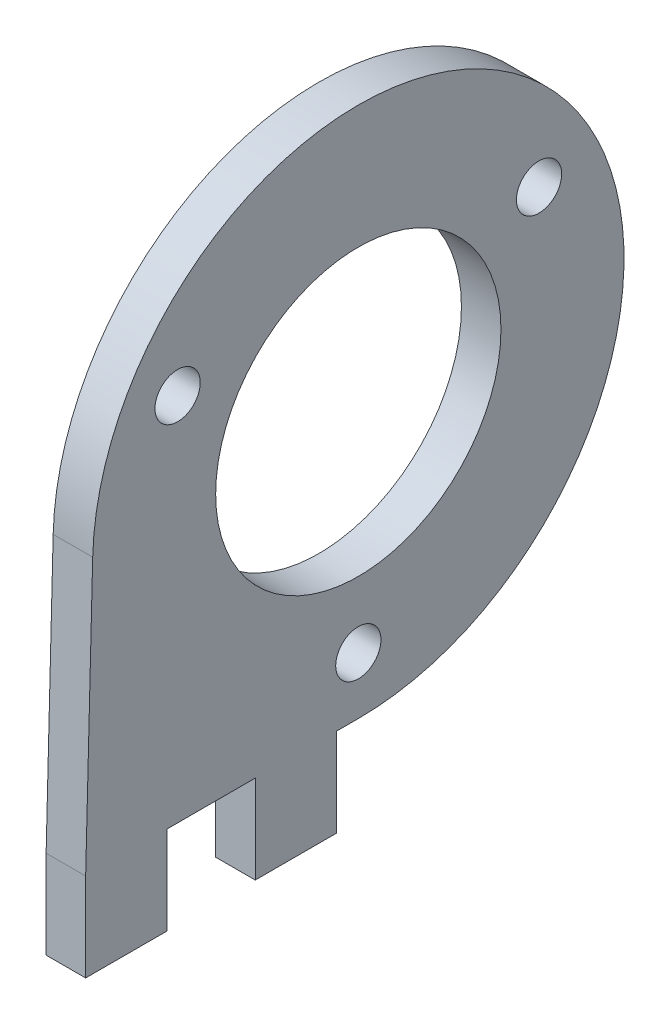
ISO-10303-21;
HEADER;
FILE_DESCRIPTION(('STEP AP214'),'2;1');
FILE_NAME('part.step','',(''),(''),'','','');
FILE_SCHEMA(('AUTOMOTIVE_DESIGN { 1 0 10303 214 1 1 1 1 }'));
ENDSEC;
DATA;
#1=APPLICATION_CONTEXT('core data for automotive mechanical design processes');
#2=APPLICATION_PROTOCOL_DEFINITION('international standard','automotive_design',2000,#1);
#3=PRODUCT_CONTEXT('',#1,'mechanical');
#4=PRODUCT('Part','Part','',(#3));
#5=PRODUCT_RELATED_PRODUCT_CATEGORY('part','',(#4));
#6=PRODUCT_DEFINITION_FORMATION('','',#4);
#7=PRODUCT_DEFINITION_CONTEXT('part definition',#1,'design');
#8=PRODUCT_DEFINITION('design','',#6,#7);
#9=PRODUCT_DEFINITION_SHAPE('','',#8);
#10=(LENGTH_UNIT() NAMED_UNIT(*) SI_UNIT(.MILLI.,.METRE.));
#11=(NAMED_UNIT(*) PLANE_ANGLE_UNIT() SI_UNIT($,.RADIAN.));
#12=(NAMED_UNIT(*) SI_UNIT($,.STERADIAN.) SOLID_ANGLE_UNIT());
#13=UNCERTAINTY_MEASURE_WITH_UNIT(LENGTH_MEASURE(1.E-05),#10,'distance_accuracy_value','');
#14=(GEOMETRIC_REPRESENTATION_CONTEXT(3) GLOBAL_UNCERTAINTY_ASSIGNED_CONTEXT((#13)) GLOBAL_UNIT_ASSIGNED_CONTEXT((#10,
#11,#12)) REPRESENTATION_CONTEXT('',''));
#15=CARTESIAN_POINT('',(0.,0.,0.));
#16=DIRECTION('',(0.,0.,1.));
#17=DIRECTION('',(1.,0.,0.));
#18=AXIS2_PLACEMENT_3D('',#15,#16,#17);
#19=CARTESIAN_POINT('',(46.8931996581965,32.950000013,-25.913619010482));
#20=DIRECTION('',(-1.,0.,0.));
#21=DIRECTION('',(0.,0.,1.));
#22=AXIS2_PLACEMENT_3D('',#19,#20,#21);
#23=CYLINDRICAL_SURFACE('',#22,1.627000048);
#24=CARTESIAN_POINT('',(-15.4686,32.950000013,-25.913619010482));
#25=DIRECTION('',(1.,0.,0.));
#26=DIRECTION('',(0.,0.,-1.));
#27=AXIS2_PLACEMENT_3D('',#24,#25,#26);
#28=CIRCLE('',#27,1.627000048);
#29=CARTESIAN_POINT('',(-15.4686,32.950000013,-24.286618962482));
#30=VERTEX_POINT('',#29);
#31=EDGE_CURVE('E192',#30,#30,#28,.T.);
#32=CARTESIAN_POINT('',(-12.626600096,32.950000013,-25.913619010482));
#33=DIRECTION('',(1.,0.,0.));
#34=DIRECTION('',(0.,0.,-1.));
#35=AXIS2_PLACEMENT_3D('',#32,#33,#34);
#36=CIRCLE('',#35,1.627000048);
#37=CARTESIAN_POINT('',(-12.626600096,32.950000013,-24.286618962482));
#38=VERTEX_POINT('',#37);
#39=EDGE_CURVE('E157',#38,#38,#36,.T.);
#40=CARTESIAN_POINT('',(-15.4686,32.950000013,-24.286618962482));
#41=CARTESIAN_POINT('',(-15.4389958343333,32.950000013,-24.286618962482));
#42=CARTESIAN_POINT('',(-15.4093916686667,32.950000013,-24.286618962482));
#43=CARTESIAN_POINT('',(-15.3501833373333,32.950000013,-24.286618962482));
#44=CARTESIAN_POINT('',(-15.3205791716667,32.950000013,-24.286618962482));
#45=CARTESIAN_POINT('',(-15.2613708403333,32.950000013,-24.286618962482));
#46=CARTESIAN_POINT('',(-15.2317666746667,32.950000013,-24.286618962482));
#47=CARTESIAN_POINT('',(-15.1725583433333,32.950000013,-24.286618962482));
#48=CARTESIAN_POINT('',(-15.1429541776667,32.950000013,-24.286618962482));
#49=CARTESIAN_POINT('',(-15.0837458463333,32.950000013,-24.286618962482));
#50=CARTESIAN_POINT('',(-15.0541416806667,32.950000013,-24.286618962482));
#51=CARTESIAN_POINT('',(-14.9949333493333,32.950000013,-24.286618962482));
#52=CARTESIAN_POINT('',(-14.9653291836667,32.950000013,-24.286618962482));
#53=CARTESIAN_POINT('',(-14.9061208523333,32.950000013,-24.286618962482));
#54=CARTESIAN_POINT('',(-14.8765166866667,32.950000013,-24.286618962482));
#55=CARTESIAN_POINT('',(-14.8173083553333,32.950000013,-24.286618962482));
#56=CARTESIAN_POINT('',(-14.7877041896667,32.950000013,-24.286618962482));
#57=CARTESIAN_POINT('',(-14.7284958583333,32.950000013,-24.286618962482));
#58=CARTESIAN_POINT('',(-14.6988916926667,32.950000013,-24.286618962482));
#59=CARTESIAN_POINT('',(-14.6396833613333,32.950000013,-24.286618962482));
#60=CARTESIAN_POINT('',(-14.6100791956667,32.950000013,-24.286618962482));
#61=CARTESIAN_POINT('',(-14.5508708643333,32.950000013,-24.286618962482));
#62=CARTESIAN_POINT('',(-14.5212666986667,32.950000013,-24.286618962482));
#63=CARTESIAN_POINT('',(-14.4620583673333,32.950000013,-24.286618962482));
#64=CARTESIAN_POINT('',(-14.4324542016667,32.950000013,-24.286618962482));
#65=CARTESIAN_POINT('',(-14.3732458703333,32.950000013,-24.286618962482));
#66=CARTESIAN_POINT('',(-14.3436417046667,32.950000013,-24.286618962482));
#67=CARTESIAN_POINT('',(-14.2844333733333,32.950000013,-24.286618962482));
#68=CARTESIAN_POINT('',(-14.2548292076667,32.950000013,-24.286618962482));
#69=CARTESIAN_POINT('',(-14.1956208763333,32.950000013,-24.286618962482));
#70=CARTESIAN_POINT('',(-14.1660167106667,32.950000013,-24.286618962482));
#71=CARTESIAN_POINT('',(-14.1068083793333,32.950000013,-24.286618962482));
#72=CARTESIAN_POINT('',(-14.0772042136667,32.950000013,-24.286618962482));
#73=CARTESIAN_POINT('',(-14.0179958823333,32.950000013,-24.286618962482));
#74=CARTESIAN_POINT('',(-13.9883917166667,32.950000013,-24.286618962482));
#75=CARTESIAN_POINT('',(-13.9291833853333,32.950000013,-24.286618962482));
#76=CARTESIAN_POINT('',(-13.8995792196667,32.950000013,-24.286618962482));
#77=CARTESIAN_POINT('',(-13.8403708883333,32.950000013,-24.286618962482));
#78=CARTESIAN_POINT('',(-13.8107667226667,32.950000013,-24.286618962482));
#79=CARTESIAN_POINT('',(-13.7515583913333,32.950000013,-24.286618962482));
#80=CARTESIAN_POINT('',(-13.7219542256667,32.950000013,-24.286618962482));
#81=CARTESIAN_POINT('',(-13.6627458943333,32.950000013,-24.286618962482));
#82=CARTESIAN_POINT('',(-13.6331417286667,32.950000013,-24.286618962482));
#83=CARTESIAN_POINT('',(-13.5739333973333,32.950000013,-24.286618962482));
#84=CARTESIAN_POINT('',(-13.5443292316667,32.950000013,-24.286618962482));
#85=CARTESIAN_POINT('',(-13.4851209003333,32.950000013,-24.286618962482));
#86=CARTESIAN_POINT('',(-13.4555167346667,32.950000013,-24.286618962482));
#87=CARTESIAN_POINT('',(-13.3963084033333,32.950000013,-24.286618962482));
#88=CARTESIAN_POINT('',(-13.3667042376667,32.950000013,-24.286618962482));
#89=CARTESIAN_POINT('',(-13.3074959063333,32.950000013,-24.286618962482));
#90=CARTESIAN_POINT('',(-13.2778917406667,32.950000013,-24.286618962482));
#91=CARTESIAN_POINT('',(-13.2186834093333,32.950000013,-24.286618962482));
#92=CARTESIAN_POINT('',(-13.1890792436667,32.950000013,-24.286618962482));
#93=CARTESIAN_POINT('',(-13.1298709123333,32.950000013,-24.286618962482));
#94=CARTESIAN_POINT('',(-13.1002667466667,32.950000013,-24.286618962482));
#95=CARTESIAN_POINT('',(-13.0410584153333,32.950000013,-24.286618962482));
#96=CARTESIAN_POINT('',(-13.0114542496667,32.950000013,-24.286618962482));
#97=CARTESIAN_POINT('',(-12.9522459183333,32.950000013,-24.286618962482));
#98=CARTESIAN_POINT('',(-12.9226417526667,32.950000013,-24.286618962482));
#99=CARTESIAN_POINT('',(-12.8634334213333,32.950000013,-24.286618962482));
#100=CARTESIAN_POINT('',(-12.8338292556667,32.950000013,-24.286618962482));
#101=CARTESIAN_POINT('',(-12.7746209243333,32.950000013,-24.286618962482));
#102=CARTESIAN_POINT('',(-12.7450167586667,32.950000013,-24.286618962482));
#103=CARTESIAN_POINT('',(-12.6858084273333,32.950000013,-24.286618962482));
#104=CARTESIAN_POINT('',(-12.6562042616667,32.950000013,-24.286618962482));
#105=CARTESIAN_POINT('',(-12.626600096,32.950000013,-24.286618962482));
#106=B_SPLINE_CURVE_WITH_KNOTS('',3,(#40,#41,#42,#43,#44,#45,#46,#47,#48,#49,#50,#51,#52,#53,
#54,#55,#56,#57,#58,#59,#60,#61,#62,#63,#64,#65,#66,#67,#68,#69,#70,#71,#72,#73,#74,#75,#76,#77,
#78,#79,#80,#81,#82,#83,#84,#85,#86,#87,#88,#89,#90,#91,#92,#93,#94,#95,#96,#97,#98,#99,#100,
#101,#102,#103,#104,#105),.UNSPECIFIED.,.F.,.F.,(4,2,2,2,2,2,2,2,2,2,2,2,2,2,2,2,2,2,2,2,2,2,2,
2,2,2,2,2,2,2,2,2,4),(0.,0.0888124969999973,0.177624994000002,0.266437490999999,
0.355249988000003,0.444062485000001,0.532874981999998,0.621687479000002,0.710499975999999,
0.799312472999997,0.888124970000001,0.976937466999998,1.065749964,1.154562461,1.243374958,
1.332187455,1.420999952,1.509812449,1.598624946,1.687437443,1.77624994,1.865062437,1.953874934,
2.042687431,2.131499928,2.220312425,2.309124922,2.397937419,2.48674991599999,2.575562413,
2.66437491,2.753187407,2.841999904),.UNSPECIFIED.);
#107=EDGE_CURVE('BSEAM34',#30,#38,#106,.T.);
#108=ORIENTED_EDGE('',*,*,#31,.F.);
#109=ORIENTED_EDGE('',*,*,#39,.T.);
#110=ORIENTED_EDGE('',*,*,#107,.T.);
#111=ORIENTED_EDGE('',*,*,#107,.F.);
#112=EDGE_LOOP('',(#108,#110,#109,#111));
#113=FACE_BOUND('',#112,.T.);
#114=ADVANCED_FACE('F34',(#113),#23,.F.);
#115=CARTESIAN_POINT('',(46.8931996581965,32.950000013,-51.8943810755177));
#116=DIRECTION('',(-1.,0.,0.));
#117=DIRECTION('',(0.,0.,1.));
#118=AXIS2_PLACEMENT_3D('',#115,#116,#117);
#119=CYLINDRICAL_SURFACE('',#118,1.62700004800001);
#120=CARTESIAN_POINT('',(-15.4686,32.950000013,-51.8943810755177));
#121=DIRECTION('',(1.,0.,0.));
#122=DIRECTION('',(0.,0.,-1.));
#123=AXIS2_PLACEMENT_3D('',#120,#121,#122);
#124=CIRCLE('',#123,1.62700004800001);
#125=CARTESIAN_POINT('',(-15.4686,32.950000013,-50.2673810275177));
#126=VERTEX_POINT('',#125);
#127=EDGE_CURVE('E189',#126,#126,#124,.T.);
#128=CARTESIAN_POINT('',(-12.626600096,32.950000013,-51.8943810755177));
#129=DIRECTION('',(1.,0.,0.));
#130=DIRECTION('',(0.,0.,-1.));
#131=AXIS2_PLACEMENT_3D('',#128,#129,#130);
#132=CIRCLE('',#131,1.62700004800001);
#133=CARTESIAN_POINT('',(-12.626600096,32.950000013,-50.2673810275177));
#134=VERTEX_POINT('',#133);
#135=EDGE_CURVE('E154',#134,#134,#132,.T.);
#136=CARTESIAN_POINT('',(-15.4686,32.950000013,-50.2673810275177));
#137=CARTESIAN_POINT('',(-15.4389958343333,32.950000013,-50.2673810275177));
#138=CARTESIAN_POINT('',(-15.4093916686667,32.950000013,-50.2673810275177));
#139=CARTESIAN_POINT('',(-15.3501833373333,32.950000013,-50.2673810275177));
#140=CARTESIAN_POINT('',(-15.3205791716667,32.950000013,-50.2673810275177));
#141=CARTESIAN_POINT('',(-15.2613708403333,32.950000013,-50.2673810275177));
#142=CARTESIAN_POINT('',(-15.2317666746667,32.950000013,-50.2673810275177));
#143=CARTESIAN_POINT('',(-15.1725583433333,32.950000013,-50.2673810275177));
#144=CARTESIAN_POINT('',(-15.1429541776667,32.950000013,-50.2673810275177));
#145=CARTESIAN_POINT('',(-15.0837458463333,32.950000013,-50.2673810275177));
#146=CARTESIAN_POINT('',(-15.0541416806667,32.950000013,-50.2673810275177));
#147=CARTESIAN_POINT('',(-14.9949333493333,32.950000013,-50.2673810275177));
#148=CARTESIAN_POINT('',(-14.9653291836667,32.950000013,-50.2673810275177));
#149=CARTESIAN_POINT('',(-14.9061208523333,32.950000013,-50.2673810275177));
#150=CARTESIAN_POINT('',(-14.8765166866667,32.950000013,-50.2673810275177));
#151=CARTESIAN_POINT('',(-14.8173083553333,32.950000013,-50.2673810275177));
#152=CARTESIAN_POINT('',(-14.7877041896667,32.950000013,-50.2673810275177));
#153=CARTESIAN_POINT('',(-14.7284958583333,32.950000013,-50.2673810275177));
#154=CARTESIAN_POINT('',(-14.6988916926667,32.950000013,-50.2673810275177));
#155=CARTESIAN_POINT('',(-14.6396833613333,32.950000013,-50.2673810275177));
#156=CARTESIAN_POINT('',(-14.6100791956667,32.950000013,-50.2673810275177));
#157=CARTESIAN_POINT('',(-14.5508708643333,32.950000013,-50.2673810275177));
#158=CARTESIAN_POINT('',(-14.5212666986667,32.950000013,-50.2673810275177));
#159=CARTESIAN_POINT('',(-14.4620583673333,32.950000013,-50.2673810275177));
#160=CARTESIAN_POINT('',(-14.4324542016667,32.950000013,-50.2673810275177));
#161=CARTESIAN_POINT('',(-14.3732458703333,32.950000013,-50.2673810275177));
#162=CARTESIAN_POINT('',(-14.3436417046667,32.950000013,-50.2673810275177));
#163=CARTESIAN_POINT('',(-14.2844333733333,32.950000013,-50.2673810275177));
#164=CARTESIAN_POINT('',(-14.2548292076667,32.950000013,-50.2673810275177));
#165=CARTESIAN_POINT('',(-14.1956208763333,32.950000013,-50.2673810275177));
#166=CARTESIAN_POINT('',(-14.1660167106667,32.950000013,-50.2673810275177));
#167=CARTESIAN_POINT('',(-14.1068083793333,32.950000013,-50.2673810275177));
#168=CARTESIAN_POINT('',(-14.0772042136667,32.950000013,-50.2673810275177));
#169=CARTESIAN_POINT('',(-14.0179958823333,32.950000013,-50.2673810275177));
#170=CARTESIAN_POINT('',(-13.9883917166667,32.950000013,-50.2673810275177));
#171=CARTESIAN_POINT('',(-13.9291833853333,32.950000013,-50.2673810275177));
#172=CARTESIAN_POINT('',(-13.8995792196667,32.950000013,-50.2673810275177));
#173=CARTESIAN_POINT('',(-13.8403708883333,32.950000013,-50.2673810275177));
#174=CARTESIAN_POINT('',(-13.8107667226667,32.950000013,-50.2673810275177));
#175=CARTESIAN_POINT('',(-13.7515583913333,32.950000013,-50.2673810275177));
#176=CARTESIAN_POINT('',(-13.7219542256667,32.950000013,-50.2673810275177));
#177=CARTESIAN_POINT('',(-13.6627458943333,32.950000013,-50.2673810275177));
#178=CARTESIAN_POINT('',(-13.6331417286667,32.950000013,-50.2673810275177));
#179=CARTESIAN_POINT('',(-13.5739333973333,32.950000013,-50.2673810275177));
#180=CARTESIAN_POINT('',(-13.5443292316667,32.950000013,-50.2673810275177));
#181=CARTESIAN_POINT('',(-13.4851209003333,32.950000013,-50.2673810275177));
#182=CARTESIAN_POINT('',(-13.4555167346667,32.950000013,-50.2673810275177));
#183=CARTESIAN_POINT('',(-13.3963084033333,32.950000013,-50.2673810275177));
#184=CARTESIAN_POINT('',(-13.3667042376667,32.950000013,-50.2673810275177));
#185=CARTESIAN_POINT('',(-13.3074959063333,32.950000013,-50.2673810275177));
#186=CARTESIAN_POINT('',(-13.2778917406667,32.950000013,-50.2673810275177));
#187=CARTESIAN_POINT('',(-13.2186834093333,32.950000013,-50.2673810275177));
#188=CARTESIAN_POINT('',(-13.1890792436667,32.950000013,-50.2673810275177));
#189=CARTESIAN_POINT('',(-13.1298709123333,32.950000013,-50.2673810275177));
#190=CARTESIAN_POINT('',(-13.1002667466667,32.950000013,-50.2673810275177));
#191=CARTESIAN_POINT('',(-13.0410584153333,32.950000013,-50.2673810275177));
#192=CARTESIAN_POINT('',(-13.0114542496667,32.950000013,-50.2673810275177));
#193=CARTESIAN_POINT('',(-12.9522459183333,32.950000013,-50.2673810275177));
#194=CARTESIAN_POINT('',(-12.9226417526667,32.950000013,-50.2673810275177));
#195=CARTESIAN_POINT('',(-12.8634334213333,32.950000013,-50.2673810275177));
#196=CARTESIAN_POINT('',(-12.8338292556667,32.950000013,-50.2673810275177));
#197=CARTESIAN_POINT('',(-12.7746209243333,32.950000013,-50.2673810275177));
#198=CARTESIAN_POINT('',(-12.7450167586667,32.950000013,-50.2673810275177));
#199=CARTESIAN_POINT('',(-12.6858084273333,32.950000013,-50.2673810275177));
#200=CARTESIAN_POINT('',(-12.6562042616667,32.950000013,-50.2673810275177));
#201=CARTESIAN_POINT('',(-12.626600096,32.950000013,-50.2673810275177));
#202=B_SPLINE_CURVE_WITH_KNOTS('',3,(#136,#137,#138,#139,#140,#141,#142,#143,#144,#145,#146,
#147,#148,#149,#150,#151,#152,#153,#154,#155,#156,#157,#158,#159,#160,#161,#162,#163,#164,#165,
#166,#167,#168,#169,#170,#171,#172,#173,#174,#175,#176,#177,#178,#179,#180,#181,#182,#183,#184,
#185,#186,#187,#188,#189,#190,#191,#192,#193,#194,#195,#196,#197,#198,#199,#200,#201),
.UNSPECIFIED.,.F.,.F.,(4,2,2,2,2,2,2,2,2,2,2,2,2,2,2,2,2,2,2,2,2,2,2,2,2,2,2,2,2,2,2,2,4),(0.,
0.0888124969999973,0.177624994000002,0.266437490999999,0.355249988000003,0.444062485000001,
0.532874981999998,0.621687479000002,0.710499975999999,0.799312472999997,0.888124970000001,
0.976937466999998,1.065749964,1.154562461,1.243374958,1.332187455,1.420999952,1.509812449,
1.598624946,1.687437443,1.77624994,1.865062437,1.953874934,2.042687431,2.131499928,2.220312425,
2.309124922,2.397937419,2.48674991599999,2.575562413,2.66437491,2.753187407,2.841999904),.UNSPECIFIED.);
#203=EDGE_CURVE('BSEAM253',#126,#134,#202,.T.);
#204=ORIENTED_EDGE('',*,*,#127,.F.);
#205=ORIENTED_EDGE('',*,*,#135,.T.);
#206=ORIENTED_EDGE('',*,*,#203,.T.);
#207=ORIENTED_EDGE('',*,*,#203,.F.);
#208=EDGE_LOOP('',(#204,#206,#205,#207));
#209=FACE_BOUND('',#208,.T.);
#210=ADVANCED_FACE('F253',(#209),#119,.F.);
#211=CARTESIAN_POINT('',(46.8931996581965,25.450000027,-38.9040000429999));
#212=DIRECTION('',(-1.,0.,0.));
#213=DIRECTION('',(0.,0.,1.));
#214=AXIS2_PLACEMENT_3D('',#211,#212,#213);
#215=CYLINDRICAL_SURFACE('',#214,10.253999939);
#216=CARTESIAN_POINT('',(-15.4686,25.450000027,-38.9040000429999));
#217=DIRECTION('',(1.,0.,0.));
#218=DIRECTION('',(0.,0.,-1.));
#219=AXIS2_PLACEMENT_3D('',#216,#217,#218);
#220=CIRCLE('',#219,10.253999939);
#221=CARTESIAN_POINT('',(-15.4686,25.450000027,-28.6500001039999));
#222=VERTEX_POINT('',#221);
#223=EDGE_CURVE('E186',#222,#222,#220,.T.);
#224=CARTESIAN_POINT('',(-12.626600096,25.450000027,-38.9040000429999));
#225=DIRECTION('',(1.,0.,0.));
#226=DIRECTION('',(0.,0.,-1.));
#227=AXIS2_PLACEMENT_3D('',#224,#225,#226);
#228=CIRCLE('',#227,10.253999939);
#229=CARTESIAN_POINT('',(-12.626600096,25.450000027,-28.6500001039999));
#230=VERTEX_POINT('',#229);
#231=EDGE_CURVE('E127',#230,#230,#228,.T.);
#232=CARTESIAN_POINT('',(-15.4686,25.450000027,-28.6500001039999));
#233=CARTESIAN_POINT('',(-15.4389958343333,25.450000027,-28.6500001039999));
#234=CARTESIAN_POINT('',(-15.4093916686667,25.450000027,-28.6500001039999));
#235=CARTESIAN_POINT('',(-15.3501833373333,25.450000027,-28.6500001039999));
#236=CARTESIAN_POINT('',(-15.3205791716667,25.450000027,-28.6500001039999));
#237=CARTESIAN_POINT('',(-15.2613708403333,25.450000027,-28.6500001039999));
#238=CARTESIAN_POINT('',(-15.2317666746667,25.450000027,-28.6500001039999));
#239=CARTESIAN_POINT('',(-15.1725583433333,25.450000027,-28.6500001039999));
#240=CARTESIAN_POINT('',(-15.1429541776667,25.450000027,-28.6500001039999));
#241=CARTESIAN_POINT('',(-15.0837458463333,25.450000027,-28.6500001039999));
#242=CARTESIAN_POINT('',(-15.0541416806667,25.450000027,-28.6500001039999));
#243=CARTESIAN_POINT('',(-14.9949333493333,25.450000027,-28.6500001039999));
#244=CARTESIAN_POINT('',(-14.9653291836667,25.450000027,-28.6500001039999));
#245=CARTESIAN_POINT('',(-14.9061208523333,25.450000027,-28.6500001039999));
#246=CARTESIAN_POINT('',(-14.8765166866667,25.450000027,-28.6500001039999));
#247=CARTESIAN_POINT('',(-14.8173083553333,25.450000027,-28.6500001039999));
#248=CARTESIAN_POINT('',(-14.7877041896667,25.450000027,-28.6500001039999));
#249=CARTESIAN_POINT('',(-14.7284958583333,25.450000027,-28.6500001039999));
#250=CARTESIAN_POINT('',(-14.6988916926667,25.450000027,-28.6500001039999));
#251=CARTESIAN_POINT('',(-14.6396833613333,25.450000027,-28.6500001039999));
#252=CARTESIAN_POINT('',(-14.6100791956667,25.450000027,-28.6500001039999));
#253=CARTESIAN_POINT('',(-14.5508708643333,25.450000027,-28.6500001039999));
#254=CARTESIAN_POINT('',(-14.5212666986667,25.450000027,-28.6500001039999));
#255=CARTESIAN_POINT('',(-14.4620583673333,25.450000027,-28.6500001039999));
#256=CARTESIAN_POINT('',(-14.4324542016667,25.450000027,-28.6500001039999));
#257=CARTESIAN_POINT('',(-14.3732458703333,25.450000027,-28.6500001039999));
#258=CARTESIAN_POINT('',(-14.3436417046667,25.450000027,-28.6500001039999));
#259=CARTESIAN_POINT('',(-14.2844333733333,25.450000027,-28.6500001039999));
#260=CARTESIAN_POINT('',(-14.2548292076667,25.450000027,-28.6500001039999));
#261=CARTESIAN_POINT('',(-14.1956208763333,25.450000027,-28.6500001039999));
#262=CARTESIAN_POINT('',(-14.1660167106667,25.450000027,-28.6500001039999));
#263=CARTESIAN_POINT('',(-14.1068083793333,25.450000027,-28.6500001039999));
#264=CARTESIAN_POINT('',(-14.0772042136667,25.450000027,-28.6500001039999));
#265=CARTESIAN_POINT('',(-14.0179958823333,25.450000027,-28.6500001039999));
#266=CARTESIAN_POINT('',(-13.9883917166667,25.450000027,-28.6500001039999));
#267=CARTESIAN_POINT('',(-13.9291833853333,25.450000027,-28.6500001039999));
#268=CARTESIAN_POINT('',(-13.8995792196667,25.450000027,-28.6500001039999));
#269=CARTESIAN_POINT('',(-13.8403708883333,25.450000027,-28.6500001039999));
#270=CARTESIAN_POINT('',(-13.8107667226667,25.450000027,-28.6500001039999));
#271=CARTESIAN_POINT('',(-13.7515583913333,25.450000027,-28.6500001039999));
#272=CARTESIAN_POINT('',(-13.7219542256667,25.450000027,-28.6500001039999));
#273=CARTESIAN_POINT('',(-13.6627458943333,25.450000027,-28.6500001039999));
#274=CARTESIAN_POINT('',(-13.6331417286667,25.450000027,-28.6500001039999));
#275=CARTESIAN_POINT('',(-13.5739333973333,25.450000027,-28.6500001039999));
#276=CARTESIAN_POINT('',(-13.5443292316667,25.450000027,-28.6500001039999));
#277=CARTESIAN_POINT('',(-13.4851209003333,25.450000027,-28.6500001039999));
#278=CARTESIAN_POINT('',(-13.4555167346667,25.450000027,-28.6500001039999));
#279=CARTESIAN_POINT('',(-13.3963084033333,25.450000027,-28.6500001039999));
#280=CARTESIAN_POINT('',(-13.3667042376667,25.450000027,-28.6500001039999));
#281=CARTESIAN_POINT('',(-13.3074959063333,25.450000027,-28.6500001039999));
#282=CARTESIAN_POINT('',(-13.2778917406667,25.450000027,-28.6500001039999));
#283=CARTESIAN_POINT('',(-13.2186834093333,25.450000027,-28.6500001039999));
#284=CARTESIAN_POINT('',(-13.1890792436667,25.450000027,-28.6500001039999));
#285=CARTESIAN_POINT('',(-13.1298709123333,25.450000027,-28.6500001039999));
#286=CARTESIAN_POINT('',(-13.1002667466667,25.450000027,-28.6500001039999));
#287=CARTESIAN_POINT('',(-13.0410584153333,25.450000027,-28.6500001039999));
#288=CARTESIAN_POINT('',(-13.0114542496667,25.450000027,-28.6500001039999));
#289=CARTESIAN_POINT('',(-12.9522459183333,25.450000027,-28.6500001039999));
#290=CARTESIAN_POINT('',(-12.9226417526667,25.450000027,-28.6500001039999));
#291=CARTESIAN_POINT('',(-12.8634334213333,25.450000027,-28.6500001039999));
#292=CARTESIAN_POINT('',(-12.8338292556667,25.450000027,-28.6500001039999));
#293=CARTESIAN_POINT('',(-12.7746209243333,25.450000027,-28.6500001039999));
#294=CARTESIAN_POINT('',(-12.7450167586667,25.450000027,-28.6500001039999));
#295=CARTESIAN_POINT('',(-12.6858084273333,25.450000027,-28.6500001039999));
#296=CARTESIAN_POINT('',(-12.6562042616667,25.450000027,-28.6500001039999));
#297=CARTESIAN_POINT('',(-12.626600096,25.450000027,-28.6500001039999));
#298=B_SPLINE_CURVE_WITH_KNOTS('',3,(#232,#233,#234,#235,#236,#237,#238,#239,#240,#241,#242,
#243,#244,#245,#246,#247,#248,#249,#250,#251,#252,#253,#254,#255,#256,#257,#258,#259,#260,#261,
#262,#263,#264,#265,#266,#267,#268,#269,#270,#271,#272,#273,#274,#275,#276,#277,#278,#279,#280,
#281,#282,#283,#284,#285,#286,#287,#288,#289,#290,#291,#292,#293,#294,#295,#296,#297),
.UNSPECIFIED.,.F.,.F.,(4,2,2,2,2,2,2,2,2,2,2,2,2,2,2,2,2,2,2,2,2,2,2,2,2,2,2,2,2,2,2,2,4),(0.,
0.0888124969999973,0.177624994000002,0.266437490999999,0.355249988000003,0.444062485000001,
0.532874981999998,0.621687479000002,0.710499975999999,0.799312472999997,0.888124970000001,
0.976937466999998,1.065749964,1.154562461,1.243374958,1.332187455,1.420999952,1.509812449,
1.598624946,1.687437443,1.77624994,1.865062437,1.953874934,2.042687431,2.131499928,2.220312425,
2.309124922,2.397937419,2.48674991599999,2.575562413,2.66437491,2.753187407,2.841999904),.UNSPECIFIED.);
#299=EDGE_CURVE('BSEAM250',#222,#230,#298,.T.);
#300=ORIENTED_EDGE('',*,*,#223,.F.);
#301=ORIENTED_EDGE('',*,*,#231,.T.);
#302=ORIENTED_EDGE('',*,*,#299,.T.);
#303=ORIENTED_EDGE('',*,*,#299,.F.);
#304=EDGE_LOOP('',(#300,#302,#301,#303));
#305=FACE_BOUND('',#304,.T.);
#306=ADVANCED_FACE('F250',(#305),#215,.F.);
#307=CARTESIAN_POINT('',(46.8931996581965,0.,-37.338));
#308=DIRECTION('',(0.,0.,1.));
#309=DIRECTION('',(1.,0.,0.));
#310=AXIS2_PLACEMENT_3D('',#307,#308,#309);
#311=PLANE('',#310);
#312=DIRECTION('',(0.,1.,0.));
#313=VECTOR('',#312,1.);
#314=CARTESIAN_POINT('',(-12.626600096,0.,-37.338));
#315=LINE('',#314,#313);
#316=CARTESIAN_POINT('',(-12.626600096,0.,-37.338));
#317=VERTEX_POINT('',#316);
#318=CARTESIAN_POINT('',(-12.626600096,6.35,-37.338));
#319=VERTEX_POINT('',#318);
#320=EDGE_CURVE('E115',#317,#319,#315,.T.);
#321=ORIENTED_EDGE('',*,*,#320,.F.);
#322=DIRECTION('',(-1.,0.,0.));
#323=VECTOR('',#322,1.);
#324=CARTESIAN_POINT('',(46.8931996581965,0.,-37.338));
#325=LINE('',#324,#323);
#326=CARTESIAN_POINT('',(-15.4686,0.,-37.338));
#327=VERTEX_POINT('',#326);
#328=EDGE_CURVE('E50',#317,#327,#325,.T.);
#329=ORIENTED_EDGE('',*,*,#328,.T.);
#330=DIRECTION('',(0.,1.,0.));
#331=VECTOR('',#330,1.);
#332=CARTESIAN_POINT('',(-15.4686,0.,-37.338));
#333=LINE('',#332,#331);
#334=CARTESIAN_POINT('',(-15.4686,6.35,-37.338));
#335=VERTEX_POINT('',#334);
#336=EDGE_CURVE('E118',#327,#335,#333,.T.);
#337=ORIENTED_EDGE('',*,*,#336,.T.);
#338=DIRECTION('',(-1.,0.,0.));
#339=VECTOR('',#338,1.);
#340=CARTESIAN_POINT('',(46.8931996581965,6.35,-37.338));
#341=LINE('',#340,#339);
#342=EDGE_CURVE('E111',#319,#335,#341,.T.);
#343=ORIENTED_EDGE('',*,*,#342,.F.);
#344=EDGE_LOOP('',(#321,#329,#337,#343));
#345=FACE_BOUND('',#344,.T.);
#346=ADVANCED_FACE('F113',(#345),#311,.F.);
#347=CARTESIAN_POINT('',(46.8931996581965,0.,0.));
#348=DIRECTION('',(0.,1.,0.));
#349=DIRECTION('',(0.,0.,1.));
#350=AXIS2_PLACEMENT_3D('',#347,#348,#349);
#351=PLANE('',#350);
#352=DIRECTION('',(0.,0.,-1.));
#353=VECTOR('',#352,1.);
#354=CARTESIAN_POINT('',(-12.626600096,0.,0.));
#355=LINE('',#354,#353);
#356=CARTESIAN_POINT('',(-12.626600096,0.,-31.496));
#357=VERTEX_POINT('',#356);
#358=EDGE_CURVE('E131',#357,#317,#355,.T.);
#359=ORIENTED_EDGE('',*,*,#358,.F.);
#360=DIRECTION('',(-1.,0.,0.));
#361=VECTOR('',#360,1.);
#362=CARTESIAN_POINT('',(46.8931996581965,0.,-31.496));
#363=LINE('',#362,#361);
#364=CARTESIAN_POINT('',(-15.4686,0.,-31.496));
#365=VERTEX_POINT('',#364);
#366=EDGE_CURVE('E198',#357,#365,#363,.T.);
#367=ORIENTED_EDGE('',*,*,#366,.T.);
#368=DIRECTION('',(0.,0.,-1.));
#369=VECTOR('',#368,1.);
#370=CARTESIAN_POINT('',(-15.4686,0.,0.));
#371=LINE('',#370,#369);
#372=EDGE_CURVE('E183',#365,#327,#371,.T.);
#373=ORIENTED_EDGE('',*,*,#372,.T.);
#374=ORIENTED_EDGE('',*,*,#328,.F.);
#375=EDGE_LOOP('',(#359,#367,#373,#374));
#376=FACE_BOUND('',#375,.T.);
#377=ADVANCED_FACE('F242',(#376),#351,.F.);
#378=CARTESIAN_POINT('',(46.8931996581965,0.,-31.496));
#379=DIRECTION('',(0.,0.,-1.));
#380=DIRECTION('',(-1.,0.,0.));
#381=AXIS2_PLACEMENT_3D('',#378,#379,#380);
#382=PLANE('',#381);
#383=DIRECTION('',(0.,-1.,0.));
#384=VECTOR('',#383,1.);
#385=CARTESIAN_POINT('',(-12.626600096,0.,-31.496));
#386=LINE('',#385,#384);
#387=CARTESIAN_POINT('',(-12.626600096,6.35,-31.496));
#388=VERTEX_POINT('',#387);
#389=EDGE_CURVE('E133',#388,#357,#386,.T.);
#390=ORIENTED_EDGE('',*,*,#389,.F.);
#391=DIRECTION('',(-1.,0.,0.));
#392=VECTOR('',#391,1.);
#393=CARTESIAN_POINT('',(46.8931996581965,6.35,-31.496));
#394=LINE('',#393,#392);
#395=CARTESIAN_POINT('',(-15.4686,6.35,-31.496));
#396=VERTEX_POINT('',#395);
#397=EDGE_CURVE('E200',#388,#396,#394,.T.);
#398=ORIENTED_EDGE('',*,*,#397,.T.);
#399=DIRECTION('',(0.,-1.,0.));
#400=VECTOR('',#399,1.);
#401=CARTESIAN_POINT('',(-15.4686,0.,-31.496));
#402=LINE('',#401,#400);
#403=EDGE_CURVE('E180',#396,#365,#402,.T.);
#404=ORIENTED_EDGE('',*,*,#403,.T.);
#405=ORIENTED_EDGE('',*,*,#366,.F.);
#406=EDGE_LOOP('',(#390,#398,#404,#405));
#407=FACE_BOUND('',#406,.T.);
#408=ADVANCED_FACE('F239',(#407),#382,.F.);
#409=CARTESIAN_POINT('',(46.8931996581965,6.35,0.));
#410=DIRECTION('',(0.,-1.,0.));
#411=DIRECTION('',(0.,0.,-1.));
#412=AXIS2_PLACEMENT_3D('',#409,#410,#411);
#413=PLANE('',#412);
#414=ORIENTED_EDGE('',*,*,#397,.F.);
#415=DIRECTION('',(0.,0.,1.));
#416=VECTOR('',#415,1.);
#417=CARTESIAN_POINT('',(-12.626600096,6.35,0.));
#418=LINE('',#417,#416);
#419=CARTESIAN_POINT('',(-12.626600096,6.35,-25.146));
#420=VERTEX_POINT('',#419);
#421=EDGE_CURVE('E138',#388,#420,#418,.T.);
#422=ORIENTED_EDGE('',*,*,#421,.T.);
#423=DIRECTION('',(-1.,0.,0.));
#424=VECTOR('',#423,1.);
#425=CARTESIAN_POINT('',(46.8931996581965,6.35,-25.146));
#426=LINE('',#425,#424);
#427=CARTESIAN_POINT('',(-15.4686,6.35,-25.146));
#428=VERTEX_POINT('',#427);
#429=EDGE_CURVE('E202',#420,#428,#426,.T.);
#430=ORIENTED_EDGE('',*,*,#429,.T.);
#431=DIRECTION('',(0.,0.,1.));
#432=VECTOR('',#431,1.);
#433=CARTESIAN_POINT('',(-15.4686,6.35,0.));
#434=LINE('',#433,#432);
#435=EDGE_CURVE('E177',#396,#428,#434,.T.);
#436=ORIENTED_EDGE('',*,*,#435,.F.);
#437=EDGE_LOOP('',(#414,#422,#430,#436));
#438=FACE_BOUND('',#437,.T.);
#439=ADVANCED_FACE('F236',(#438),#413,.T.);
#440=CARTESIAN_POINT('',(46.8931996581965,0.,-25.146));
#441=DIRECTION('',(0.,0.,1.));
#442=DIRECTION('',(1.,0.,0.));
#443=AXIS2_PLACEMENT_3D('',#440,#441,#442);
#444=PLANE('',#443);
#445=DIRECTION('',(0.,1.,0.));
#446=VECTOR('',#445,1.);
#447=CARTESIAN_POINT('',(-12.626600096,0.,-25.146));
#448=LINE('',#447,#446);
#449=CARTESIAN_POINT('',(-12.626600096,0.,-25.146));
#450=VERTEX_POINT('',#449);
#451=EDGE_CURVE('E140',#450,#420,#448,.T.);
#452=ORIENTED_EDGE('',*,*,#451,.F.);
#453=DIRECTION('',(-1.,0.,0.));
#454=VECTOR('',#453,1.);
#455=CARTESIAN_POINT('',(46.8931996581965,0.,-25.146));
#456=LINE('',#455,#454);
#457=CARTESIAN_POINT('',(-15.4686,0.,-25.146));
#458=VERTEX_POINT('',#457);
#459=EDGE_CURVE('E204',#450,#458,#456,.T.);
#460=ORIENTED_EDGE('',*,*,#459,.T.);
#461=DIRECTION('',(0.,1.,0.));
#462=VECTOR('',#461,1.);
#463=CARTESIAN_POINT('',(-15.4686,0.,-25.146));
#464=LINE('',#463,#462);
#465=EDGE_CURVE('E174',#458,#428,#464,.T.);
#466=ORIENTED_EDGE('',*,*,#465,.T.);
#467=ORIENTED_EDGE('',*,*,#429,.F.);
#468=EDGE_LOOP('',(#452,#460,#466,#467));
#469=FACE_BOUND('',#468,.T.);
#470=ADVANCED_FACE('F231',(#469),#444,.F.);
#471=CARTESIAN_POINT('',(46.8931996581965,0.,0.));
#472=DIRECTION('',(0.,1.,0.));
#473=DIRECTION('',(0.,0.,1.));
#474=AXIS2_PLACEMENT_3D('',#471,#472,#473);
#475=PLANE('',#474);
#476=DIRECTION('',(0.,0.,-1.));
#477=VECTOR('',#476,1.);
#478=CARTESIAN_POINT('',(-12.626600096,0.,0.));
#479=LINE('',#478,#477);
#480=CARTESIAN_POINT('',(-12.626600096,0.,-19.304));
#481=VERTEX_POINT('',#480);
#482=EDGE_CURVE('E143',#481,#450,#479,.T.);
#483=ORIENTED_EDGE('',*,*,#482,.F.);
#484=DIRECTION('',(-1.,0.,0.));
#485=VECTOR('',#484,1.);
#486=CARTESIAN_POINT('',(46.8931996581965,0.,-19.304));
#487=LINE('',#486,#485);
#488=CARTESIAN_POINT('',(-15.4686,0.,-19.304));
#489=VERTEX_POINT('',#488);
#490=EDGE_CURVE('E206',#481,#489,#487,.T.);
#491=ORIENTED_EDGE('',*,*,#490,.T.);
#492=DIRECTION('',(0.,0.,-1.));
#493=VECTOR('',#492,1.);
#494=CARTESIAN_POINT('',(-15.4686,0.,0.));
#495=LINE('',#494,#493);
#496=EDGE_CURVE('E171',#489,#458,#495,.T.);
#497=ORIENTED_EDGE('',*,*,#496,.T.);
#498=ORIENTED_EDGE('',*,*,#459,.F.);
#499=EDGE_LOOP('',(#483,#491,#497,#498));
#500=FACE_BOUND('',#499,.T.);
#501=ADVANCED_FACE('F229',(#500),#475,.F.);
#502=CARTESIAN_POINT('',(46.8931996581965,0.,-19.304));
#503=DIRECTION('',(0.,0.,-1.));
#504=DIRECTION('',(-1.,0.,0.));
#505=AXIS2_PLACEMENT_3D('',#502,#503,#504);
#506=PLANE('',#505);
#507=DIRECTION('',(0.,-1.,0.));
#508=VECTOR('',#507,1.);
#509=CARTESIAN_POINT('',(-12.626600096,0.,-19.304));
#510=LINE('',#509,#508);
#511=CARTESIAN_POINT('',(-12.626600096,6.35,-19.304));
#512=VERTEX_POINT('',#511);
#513=EDGE_CURVE('E146',#512,#481,#510,.T.);
#514=ORIENTED_EDGE('',*,*,#513,.F.);
#515=DIRECTION('',(-1.,0.,0.));
#516=VECTOR('',#515,1.);
#517=CARTESIAN_POINT('',(46.8931996581965,6.35,-19.304));
#518=LINE('',#517,#516);
#519=CARTESIAN_POINT('',(-15.4686,6.35,-19.304));
#520=VERTEX_POINT('',#519);
#521=EDGE_CURVE('E208',#512,#520,#518,.T.);
#522=ORIENTED_EDGE('',*,*,#521,.T.);
#523=DIRECTION('',(0.,-1.,0.));
#524=VECTOR('',#523,1.);
#525=CARTESIAN_POINT('',(-15.4686,0.,-19.304));
#526=LINE('',#525,#524);
#527=EDGE_CURVE('E168',#520,#489,#526,.T.);
#528=ORIENTED_EDGE('',*,*,#527,.T.);
#529=ORIENTED_EDGE('',*,*,#490,.F.);
#530=EDGE_LOOP('',(#514,#522,#528,#529));
#531=FACE_BOUND('',#530,.T.);
#532=ADVANCED_FACE('F225',(#531),#506,.F.);
#533=CARTESIAN_POINT('',(46.8931996581965,-0.494323215796406,-19.1271145712344));
#534=DIRECTION('',(0.,0.0258354815066027,0.999666208239191));
#535=DIRECTION('',(0.,-0.999666208239191,0.0258354815066027));
#536=AXIS2_PLACEMENT_3D('',#533,#534,#535);
#537=PLANE('',#536);
#538=ORIENTED_EDGE('',*,*,#521,.F.);
#539=DIRECTION('',(0.,0.999666208239191,-0.0258354815066027));
#540=VECTOR('',#539,1.);
#541=CARTESIAN_POINT('',(-12.626600096,-0.494323215796405,-19.1271145712344));
#542=LINE('',#541,#540);
#543=CARTESIAN_POINT('',(-12.626600096,25.9434577244737,-19.8103754386403));
#544=VERTEX_POINT('',#543);
#545=EDGE_CURVE('E149',#512,#544,#542,.T.);
#546=ORIENTED_EDGE('',*,*,#545,.T.);
#547=DIRECTION('',(-1.,0.,0.));
#548=VECTOR('',#547,1.);
#549=CARTESIAN_POINT('',(46.8931996581965,25.9434577244737,-19.8103754386403));
#550=LINE('',#549,#548);
#551=CARTESIAN_POINT('',(-15.4686,25.9434577244737,-19.8103754386403));
#552=VERTEX_POINT('',#551);
#553=EDGE_CURVE('E43',#544,#552,#550,.T.);
#554=ORIENTED_EDGE('',*,*,#553,.T.);
#555=DIRECTION('',(0.,0.999666208239191,-0.0258354815066027));
#556=VECTOR('',#555,1.);
#557=CARTESIAN_POINT('',(-15.4686,-0.494323215796406,-19.1271145712344));
#558=LINE('',#557,#556);
#559=EDGE_CURVE('E165',#520,#552,#558,.T.);
#560=ORIENTED_EDGE('',*,*,#559,.F.);
#561=EDGE_LOOP('',(#538,#546,#554,#560));
#562=FACE_BOUND('',#561,.T.);
#563=ADVANCED_FACE('F213',(#562),#537,.T.);
#564=CARTESIAN_POINT('',(46.8931996581965,25.450000027,-38.9040000429999));
#565=DIRECTION('',(-1.,0.,0.));
#566=DIRECTION('',(0.,0.,1.));
#567=AXIS2_PLACEMENT_3D('',#564,#565,#566);
#568=CYLINDRICAL_SURFACE('',#567,19.100000027);
#569=CARTESIAN_POINT('',(-12.626600096,25.450000027,-38.9040000429999));
#570=DIRECTION('',(1.,0.,0.));
#571=DIRECTION('',(0.,0.,-1.));
#572=AXIS2_PLACEMENT_3D('',#569,#570,#571);
#573=CIRCLE('',#572,19.100000027);
#574=CARTESIAN_POINT('',(-12.626600096,6.35,-38.9040000429999));
#575=VERTEX_POINT('',#574);
#576=EDGE_CURVE('E57',#575,#544,#573,.T.);
#577=ORIENTED_EDGE('',*,*,#576,.F.);
#578=DIRECTION('',(-1.,0.,0.));
#579=VECTOR('',#578,1.);
#580=CARTESIAN_POINT('',(46.8931996581965,6.35,-38.9040000429999));
#581=LINE('',#580,#579);
#582=CARTESIAN_POINT('',(-15.4686,6.35,-38.9040000429999));
#583=VERTEX_POINT('',#582);
#584=EDGE_CURVE('E11',#575,#583,#581,.T.);
#585=ORIENTED_EDGE('',*,*,#584,.T.);
#586=CARTESIAN_POINT('',(-15.4686,25.450000027,-38.9040000429999));
#587=DIRECTION('',(1.,0.,0.));
#588=DIRECTION('',(0.,0.,-1.));
#589=AXIS2_PLACEMENT_3D('',#586,#587,#588);
#590=CIRCLE('',#589,19.100000027);
#591=EDGE_CURVE('E162',#583,#552,#590,.T.);
#592=ORIENTED_EDGE('',*,*,#591,.T.);
#593=ORIENTED_EDGE('',*,*,#553,.F.);
#594=EDGE_LOOP('',(#577,#585,#592,#593));
#595=FACE_BOUND('',#594,.T.);
#596=ADVANCED_FACE('F216',(#595),#568,.T.);
#597=CARTESIAN_POINT('',(46.8931996581965,6.34999999999996,0.));
#598=DIRECTION('',(0.,1.,0.));
#599=DIRECTION('',(0.,0.,1.));
#600=AXIS2_PLACEMENT_3D('',#597,#598,#599);
#601=PLANE('',#600);
#602=DIRECTION('',(0.,0.,-1.));
#603=VECTOR('',#602,1.);
#604=CARTESIAN_POINT('',(-12.626600096,6.34999999999996,0.));
#605=LINE('',#604,#603);
#606=EDGE_CURVE('E125',#319,#575,#605,.T.);
#607=ORIENTED_EDGE('',*,*,#606,.F.);
#608=ORIENTED_EDGE('',*,*,#342,.T.);
#609=DIRECTION('',(0.,0.,-1.));
#610=VECTOR('',#609,1.);
#611=CARTESIAN_POINT('',(-15.4686,6.34999999999996,0.));
#612=LINE('',#611,#610);
#613=EDGE_CURVE('E160',#335,#583,#612,.T.);
#614=ORIENTED_EDGE('',*,*,#613,.T.);
#615=ORIENTED_EDGE('',*,*,#584,.F.);
#616=EDGE_LOOP('',(#607,#608,#614,#615));
#617=FACE_BOUND('',#616,.T.);
#618=ADVANCED_FACE('F36',(#617),#601,.F.);
#619=CARTESIAN_POINT('',(-15.4686,0.,0.));
#620=DIRECTION('',(1.,0.,0.));
#621=DIRECTION('',(0.,0.,-1.));
#622=AXIS2_PLACEMENT_3D('',#619,#620,#621);
#623=PLANE('',#622);
#624=ORIENTED_EDGE('',*,*,#613,.F.);
#625=ORIENTED_EDGE('',*,*,#336,.F.);
#626=ORIENTED_EDGE('',*,*,#372,.F.);
#627=ORIENTED_EDGE('',*,*,#403,.F.);
#628=ORIENTED_EDGE('',*,*,#435,.T.);
#629=ORIENTED_EDGE('',*,*,#465,.F.);
#630=ORIENTED_EDGE('',*,*,#496,.F.);
#631=ORIENTED_EDGE('',*,*,#527,.F.);
#632=ORIENTED_EDGE('',*,*,#559,.T.);
#633=ORIENTED_EDGE('',*,*,#591,.F.);
#634=EDGE_LOOP('',(#624,#625,#626,#627,#628,#629,#630,#631,#632,#633));
#635=FACE_BOUND('',#634,.T.);
#636=ORIENTED_EDGE('',*,*,#223,.T.);
#637=EDGE_LOOP('',(#636));
#638=FACE_BOUND('',#637,.T.);
#639=ORIENTED_EDGE('',*,*,#127,.T.);
#640=EDGE_LOOP('',(#639));
#641=FACE_BOUND('',#640,.T.);
#642=ORIENTED_EDGE('',*,*,#31,.T.);
#643=EDGE_LOOP('',(#642));
#644=FACE_BOUND('',#643,.T.);
#645=CARTESIAN_POINT('',(-15.4686,10.450000055,-38.9040000429999));
#646=DIRECTION('',(1.,0.,0.));
#647=DIRECTION('',(0.,0.,-1.));
#648=AXIS2_PLACEMENT_3D('',#645,#646,#647);
#649=CIRCLE('',#648,1.62700004800001);
#650=CARTESIAN_POINT('',(-15.4686,10.450000055,-37.2769999949999));
#651=VERTEX_POINT('',#650);
#652=EDGE_CURVE('E122',#651,#651,#649,.T.);
#653=ORIENTED_EDGE('',*,*,#652,.T.);
#654=EDGE_LOOP('',(#653));
#655=FACE_BOUND('',#654,.T.);
#656=ADVANCED_FACE('F219',(#635,#638,#641,#644,#655),#623,.F.);
#657=CARTESIAN_POINT('',(46.8931996581965,10.450000055,-38.9040000429999));
#658=DIRECTION('',(-1.,0.,0.));
#659=DIRECTION('',(0.,0.,1.));
#660=AXIS2_PLACEMENT_3D('',#657,#658,#659);
#661=CYLINDRICAL_SURFACE('',#660,1.62700004800001);
#662=CARTESIAN_POINT('',(-12.626600096,10.450000055,-38.9040000429999));
#663=DIRECTION('',(1.,0.,0.));
#664=DIRECTION('',(0.,0.,-1.));
#665=AXIS2_PLACEMENT_3D('',#662,#663,#664);
#666=CIRCLE('',#665,1.62700004800001);
#667=CARTESIAN_POINT('',(-12.626600096,10.450000055,-37.2769999949999));
#668=VERTEX_POINT('',#667);
#669=EDGE_CURVE('E38',#668,#668,#666,.T.);
#670=CARTESIAN_POINT('',(-15.4686,10.450000055,-37.2769999949999));
#671=CARTESIAN_POINT('',(-15.4389958343333,10.450000055,-37.2769999949999));
#672=CARTESIAN_POINT('',(-15.4093916686667,10.450000055,-37.2769999949999));
#673=CARTESIAN_POINT('',(-15.3501833373333,10.450000055,-37.2769999949999));
#674=CARTESIAN_POINT('',(-15.3205791716667,10.450000055,-37.2769999949999));
#675=CARTESIAN_POINT('',(-15.2613708403333,10.450000055,-37.2769999949999));
#676=CARTESIAN_POINT('',(-15.2317666746667,10.450000055,-37.2769999949999));
#677=CARTESIAN_POINT('',(-15.1725583433333,10.450000055,-37.2769999949999));
#678=CARTESIAN_POINT('',(-15.1429541776667,10.450000055,-37.2769999949999));
#679=CARTESIAN_POINT('',(-15.0837458463333,10.450000055,-37.2769999949999));
#680=CARTESIAN_POINT('',(-15.0541416806667,10.450000055,-37.2769999949999));
#681=CARTESIAN_POINT('',(-14.9949333493333,10.450000055,-37.2769999949999));
#682=CARTESIAN_POINT('',(-14.9653291836667,10.450000055,-37.2769999949999));
#683=CARTESIAN_POINT('',(-14.9061208523333,10.450000055,-37.2769999949999));
#684=CARTESIAN_POINT('',(-14.8765166866667,10.450000055,-37.2769999949999));
#685=CARTESIAN_POINT('',(-14.8173083553333,10.450000055,-37.2769999949999));
#686=CARTESIAN_POINT('',(-14.7877041896667,10.450000055,-37.2769999949999));
#687=CARTESIAN_POINT('',(-14.7284958583333,10.450000055,-37.2769999949999));
#688=CARTESIAN_POINT('',(-14.6988916926667,10.450000055,-37.2769999949999));
#689=CARTESIAN_POINT('',(-14.6396833613333,10.450000055,-37.2769999949999));
#690=CARTESIAN_POINT('',(-14.6100791956667,10.450000055,-37.2769999949999));
#691=CARTESIAN_POINT('',(-14.5508708643333,10.450000055,-37.2769999949999));
#692=CARTESIAN_POINT('',(-14.5212666986667,10.450000055,-37.2769999949999));
#693=CARTESIAN_POINT('',(-14.4620583673333,10.450000055,-37.2769999949999));
#694=CARTESIAN_POINT('',(-14.4324542016667,10.450000055,-37.2769999949999));
#695=CARTESIAN_POINT('',(-14.3732458703333,10.450000055,-37.2769999949999));
#696=CARTESIAN_POINT('',(-14.3436417046667,10.450000055,-37.2769999949999));
#697=CARTESIAN_POINT('',(-14.2844333733333,10.450000055,-37.2769999949999));
#698=CARTESIAN_POINT('',(-14.2548292076667,10.450000055,-37.2769999949999));
#699=CARTESIAN_POINT('',(-14.1956208763333,10.450000055,-37.2769999949999));
#700=CARTESIAN_POINT('',(-14.1660167106667,10.450000055,-37.2769999949999));
#701=CARTESIAN_POINT('',(-14.1068083793333,10.450000055,-37.2769999949999));
#702=CARTESIAN_POINT('',(-14.0772042136667,10.450000055,-37.2769999949999));
#703=CARTESIAN_POINT('',(-14.0179958823333,10.450000055,-37.2769999949999));
#704=CARTESIAN_POINT('',(-13.9883917166667,10.450000055,-37.2769999949999));
#705=CARTESIAN_POINT('',(-13.9291833853333,10.450000055,-37.2769999949999));
#706=CARTESIAN_POINT('',(-13.8995792196667,10.450000055,-37.2769999949999));
#707=CARTESIAN_POINT('',(-13.8403708883333,10.450000055,-37.2769999949999));
#708=CARTESIAN_POINT('',(-13.8107667226667,10.450000055,-37.2769999949999));
#709=CARTESIAN_POINT('',(-13.7515583913333,10.450000055,-37.2769999949999));
#710=CARTESIAN_POINT('',(-13.7219542256667,10.450000055,-37.2769999949999));
#711=CARTESIAN_POINT('',(-13.6627458943333,10.450000055,-37.2769999949999));
#712=CARTESIAN_POINT('',(-13.6331417286667,10.450000055,-37.2769999949999));
#713=CARTESIAN_POINT('',(-13.5739333973333,10.450000055,-37.2769999949999));
#714=CARTESIAN_POINT('',(-13.5443292316667,10.450000055,-37.2769999949999));
#715=CARTESIAN_POINT('',(-13.4851209003333,10.450000055,-37.2769999949999));
#716=CARTESIAN_POINT('',(-13.4555167346667,10.450000055,-37.2769999949999));
#717=CARTESIAN_POINT('',(-13.3963084033333,10.450000055,-37.2769999949999));
#718=CARTESIAN_POINT('',(-13.3667042376667,10.450000055,-37.2769999949999));
#719=CARTESIAN_POINT('',(-13.3074959063333,10.450000055,-37.2769999949999));
#720=CARTESIAN_POINT('',(-13.2778917406667,10.450000055,-37.2769999949999));
#721=CARTESIAN_POINT('',(-13.2186834093333,10.450000055,-37.2769999949999));
#722=CARTESIAN_POINT('',(-13.1890792436667,10.450000055,-37.2769999949999));
#723=CARTESIAN_POINT('',(-13.1298709123333,10.450000055,-37.2769999949999));
#724=CARTESIAN_POINT('',(-13.1002667466667,10.450000055,-37.2769999949999));
#725=CARTESIAN_POINT('',(-13.0410584153333,10.450000055,-37.2769999949999));
#726=CARTESIAN_POINT('',(-13.0114542496667,10.450000055,-37.2769999949999));
#727=CARTESIAN_POINT('',(-12.9522459183333,10.450000055,-37.2769999949999));
#728=CARTESIAN_POINT('',(-12.9226417526667,10.450000055,-37.2769999949999));
#729=CARTESIAN_POINT('',(-12.8634334213333,10.450000055,-37.2769999949999));
#730=CARTESIAN_POINT('',(-12.8338292556667,10.450000055,-37.2769999949999));
#731=CARTESIAN_POINT('',(-12.7746209243333,10.450000055,-37.2769999949999));
#732=CARTESIAN_POINT('',(-12.7450167586667,10.450000055,-37.2769999949999));
#733=CARTESIAN_POINT('',(-12.6858084273333,10.450000055,-37.2769999949999));
#734=CARTESIAN_POINT('',(-12.6562042616667,10.450000055,-37.2769999949999));
#735=CARTESIAN_POINT('',(-12.626600096,10.450000055,-37.2769999949999));
#736=B_SPLINE_CURVE_WITH_KNOTS('',3,(#670,#671,#672,#673,#674,#675,#676,#677,#678,#679,#680,
#681,#682,#683,#684,#685,#686,#687,#688,#689,#690,#691,#692,#693,#694,#695,#696,#697,#698,#699,
#700,#701,#702,#703,#704,#705,#706,#707,#708,#709,#710,#711,#712,#713,#714,#715,#716,#717,#718,
#719,#720,#721,#722,#723,#724,#725,#726,#727,#728,#729,#730,#731,#732,#733,#734,#735),
.UNSPECIFIED.,.F.,.F.,(4,2,2,2,2,2,2,2,2,2,2,2,2,2,2,2,2,2,2,2,2,2,2,2,2,2,2,2,2,2,2,2,4),(0.,
0.0888124969999973,0.177624994000002,0.266437490999999,0.355249988000003,0.444062485000001,
0.532874981999998,0.621687479000002,0.710499975999999,0.799312472999997,0.888124970000001,
0.976937466999998,1.065749964,1.154562461,1.243374958,1.332187455,1.420999952,1.509812449,
1.598624946,1.687437443,1.77624994,1.865062437,1.953874934,2.042687431,2.131499928,2.220312425,
2.309124922,2.397937419,2.48674991599999,2.575562413,2.66437491,2.753187407,2.841999904),.UNSPECIFIED.);
#737=EDGE_CURVE('BSEAM264',#651,#668,#736,.T.);
#738=ORIENTED_EDGE('',*,*,#652,.F.);
#739=ORIENTED_EDGE('',*,*,#669,.T.);
#740=ORIENTED_EDGE('',*,*,#737,.T.);
#741=ORIENTED_EDGE('',*,*,#737,.F.);
#742=EDGE_LOOP('',(#738,#740,#739,#741));
#743=FACE_BOUND('',#742,.T.);
#744=ADVANCED_FACE('F264',(#743),#661,.F.);
#745=CARTESIAN_POINT('',(-12.626600096,0.,0.));
#746=DIRECTION('',(1.,0.,0.));
#747=DIRECTION('',(0.,0.,-1.));
#748=AXIS2_PLACEMENT_3D('',#745,#746,#747);
#749=PLANE('',#748);
#750=ORIENTED_EDGE('',*,*,#39,.F.);
#751=EDGE_LOOP('',(#750));
#752=FACE_BOUND('',#751,.T.);
#753=ORIENTED_EDGE('',*,*,#135,.F.);
#754=EDGE_LOOP('',(#753));
#755=FACE_BOUND('',#754,.T.);
#756=ORIENTED_EDGE('',*,*,#231,.F.);
#757=EDGE_LOOP('',(#756));
#758=FACE_BOUND('',#757,.T.);
#759=ORIENTED_EDGE('',*,*,#669,.F.);
#760=EDGE_LOOP('',(#759));
#761=FACE_BOUND('',#760,.T.);
#762=ORIENTED_EDGE('',*,*,#320,.T.);
#763=ORIENTED_EDGE('',*,*,#606,.T.);
#764=ORIENTED_EDGE('',*,*,#576,.T.);
#765=ORIENTED_EDGE('',*,*,#545,.F.);
#766=ORIENTED_EDGE('',*,*,#513,.T.);
#767=ORIENTED_EDGE('',*,*,#482,.T.);
#768=ORIENTED_EDGE('',*,*,#451,.T.);
#769=ORIENTED_EDGE('',*,*,#421,.F.);
#770=ORIENTED_EDGE('',*,*,#389,.T.);
#771=ORIENTED_EDGE('',*,*,#358,.T.);
#772=EDGE_LOOP('',(#762,#763,#764,#765,#766,#767,#768,#769,#770,#771));
#773=FACE_BOUND('',#772,.T.);
#774=ADVANCED_FACE('F129',(#752,#755,#758,#761,#773),#749,.T.);
#775=CLOSED_SHELL('',(#114,#210,#306,#346,#377,#408,#439,#470,#501,#532,#563,#596,#618,#656,
#744,#774));
#776=MANIFOLD_SOLID_BREP('B2',#775);
#777=ADVANCED_BREP_SHAPE_REPRESENTATION('',(#18,#776),#14);
#778=SHAPE_DEFINITION_REPRESENTATION(#9,#777);
ENDSEC;
END-ISO-10303-21;
